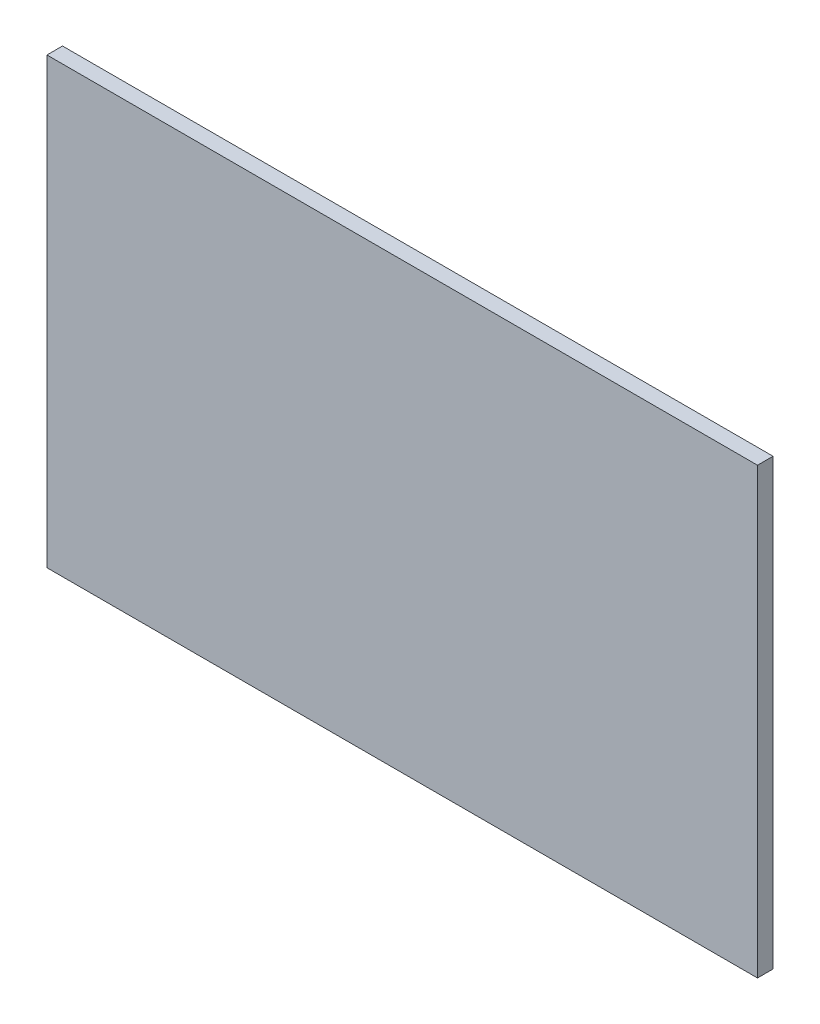
ISO-10303-21;
HEADER;
FILE_DESCRIPTION(('STEP AP214'),'2;1');
FILE_NAME('part.step','',(''),(''),'','','');
FILE_SCHEMA(('AUTOMOTIVE_DESIGN { 1 0 10303 214 1 1 1 1 }'));
ENDSEC;
DATA;
#1=APPLICATION_CONTEXT('core data for automotive mechanical design processes');
#2=APPLICATION_PROTOCOL_DEFINITION('international standard','automotive_design',2000,#1);
#3=PRODUCT_CONTEXT('',#1,'mechanical');
#4=PRODUCT('Part','Part','',(#3));
#5=PRODUCT_RELATED_PRODUCT_CATEGORY('part','',(#4));
#6=PRODUCT_DEFINITION_FORMATION('','',#4);
#7=PRODUCT_DEFINITION_CONTEXT('part definition',#1,'design');
#8=PRODUCT_DEFINITION('design','',#6,#7);
#9=PRODUCT_DEFINITION_SHAPE('','',#8);
#10=(LENGTH_UNIT() NAMED_UNIT(*) SI_UNIT(.MILLI.,.METRE.));
#11=(NAMED_UNIT(*) PLANE_ANGLE_UNIT() SI_UNIT($,.RADIAN.));
#12=(NAMED_UNIT(*) SI_UNIT($,.STERADIAN.) SOLID_ANGLE_UNIT());
#13=UNCERTAINTY_MEASURE_WITH_UNIT(LENGTH_MEASURE(1.E-05),#10,'distance_accuracy_value','');
#14=(GEOMETRIC_REPRESENTATION_CONTEXT(3) GLOBAL_UNCERTAINTY_ASSIGNED_CONTEXT((#13)) GLOBAL_UNIT_ASSIGNED_CONTEXT((#10,
#11,#12)) REPRESENTATION_CONTEXT('',''));
#15=CARTESIAN_POINT('',(0.,0.,0.));
#16=DIRECTION('',(0.,0.,1.));
#17=DIRECTION('',(1.,0.,0.));
#18=AXIS2_PLACEMENT_3D('',#15,#16,#17);
#19=CARTESIAN_POINT('',(98.15,-115.3,1.635));
#20=DIRECTION('',(0.,0.,-1.));
#21=DIRECTION('',(0.,-1.,0.));
#22=AXIS2_PLACEMENT_3D('',#19,#20,#21);
#23=PLANE('',#22);
#24=DIRECTION('',(0.,-1.,0.));
#25=VECTOR('',#24,1.);
#26=CARTESIAN_POINT('',(98.95,-114.8,1.635));
#27=LINE('',#26,#25);
#28=CARTESIAN_POINT('',(98.95,-114.8,1.635));
#29=VERTEX_POINT('',#28);
#30=CARTESIAN_POINT('',(98.95,-115.8,1.635));
#31=VERTEX_POINT('',#30);
#32=EDGE_CURVE('E20',#29,#31,#27,.T.);
#33=ORIENTED_EDGE('',*,*,#32,.F.);
#34=DIRECTION('',(1.,0.,0.));
#35=VECTOR('',#34,1.);
#36=CARTESIAN_POINT('',(97.35,-114.8,1.635));
#37=LINE('',#36,#35);
#38=CARTESIAN_POINT('',(97.35,-114.8,1.635));
#39=VERTEX_POINT('',#38);
#40=EDGE_CURVE('E62',#39,#29,#37,.T.);
#41=ORIENTED_EDGE('',*,*,#40,.F.);
#42=DIRECTION('',(0.,1.,0.));
#43=VECTOR('',#42,1.);
#44=CARTESIAN_POINT('',(97.35,-115.8,1.635));
#45=LINE('',#44,#43);
#46=CARTESIAN_POINT('',(97.35,-115.8,1.635));
#47=VERTEX_POINT('',#46);
#48=EDGE_CURVE('E90',#47,#39,#45,.T.);
#49=ORIENTED_EDGE('',*,*,#48,.F.);
#50=DIRECTION('',(-1.,0.,0.));
#51=VECTOR('',#50,1.);
#52=CARTESIAN_POINT('',(98.95,-115.8,1.635));
#53=LINE('',#52,#51);
#54=EDGE_CURVE('E100',#31,#47,#53,.T.);
#55=ORIENTED_EDGE('',*,*,#54,.F.);
#56=EDGE_LOOP('',(#33,#41,#49,#55));
#57=FACE_BOUND('',#56,.T.);
#58=ADVANCED_FACE('F17',(#57),#23,.F.);
#59=CARTESIAN_POINT('',(98.15,-115.3,1.6));
#60=DIRECTION('',(0.,0.,-1.));
#61=DIRECTION('',(0.,-1.,0.));
#62=AXIS2_PLACEMENT_3D('',#59,#60,#61);
#63=PLANE('',#62);
#64=DIRECTION('',(-1.,0.,0.));
#65=VECTOR('',#64,1.);
#66=CARTESIAN_POINT('',(98.95,-115.8,1.6));
#67=LINE('',#66,#65);
#68=CARTESIAN_POINT('',(98.95,-115.8,1.6));
#69=VERTEX_POINT('',#68);
#70=CARTESIAN_POINT('',(97.35,-115.8,1.6));
#71=VERTEX_POINT('',#70);
#72=EDGE_CURVE('E83',#69,#71,#67,.T.);
#73=ORIENTED_EDGE('',*,*,#72,.T.);
#74=DIRECTION('',(0.,1.,0.));
#75=VECTOR('',#74,1.);
#76=CARTESIAN_POINT('',(97.35,-115.8,1.6));
#77=LINE('',#76,#75);
#78=CARTESIAN_POINT('',(97.35,-114.8,1.6));
#79=VERTEX_POINT('',#78);
#80=EDGE_CURVE('E80',#71,#79,#77,.T.);
#81=ORIENTED_EDGE('',*,*,#80,.T.);
#82=DIRECTION('',(1.,0.,0.));
#83=VECTOR('',#82,1.);
#84=CARTESIAN_POINT('',(97.35,-114.8,1.6));
#85=LINE('',#84,#83);
#86=CARTESIAN_POINT('',(98.95,-114.8,1.6));
#87=VERTEX_POINT('',#86);
#88=EDGE_CURVE('E70',#79,#87,#85,.T.);
#89=ORIENTED_EDGE('',*,*,#88,.T.);
#90=DIRECTION('',(0.,-1.,0.));
#91=VECTOR('',#90,1.);
#92=CARTESIAN_POINT('',(98.95,-114.8,1.6));
#93=LINE('',#92,#91);
#94=EDGE_CURVE('E11',#87,#69,#93,.T.);
#95=ORIENTED_EDGE('',*,*,#94,.T.);
#96=EDGE_LOOP('',(#73,#81,#89,#95));
#97=FACE_BOUND('',#96,.T.);
#98=ADVANCED_FACE('F81',(#97),#63,.T.);
#99=CARTESIAN_POINT('',(98.95,-114.8,1.6));
#100=DIRECTION('',(1.,0.,0.));
#101=DIRECTION('',(0.,1.,0.));
#102=AXIS2_PLACEMENT_3D('',#99,#100,#101);
#103=PLANE('',#102);
#104=DIRECTION('',(0.,0.,1.));
#105=VECTOR('',#104,1.);
#106=CARTESIAN_POINT('',(98.95,-114.8,1.6));
#107=LINE('',#106,#105);
#108=EDGE_CURVE('E76',#87,#29,#107,.T.);
#109=ORIENTED_EDGE('',*,*,#108,.T.);
#110=ORIENTED_EDGE('',*,*,#32,.T.);
#111=DIRECTION('',(0.,0.,1.));
#112=VECTOR('',#111,1.);
#113=CARTESIAN_POINT('',(98.95,-115.8,1.6));
#114=LINE('',#113,#112);
#115=EDGE_CURVE('E137',#69,#31,#114,.T.);
#116=ORIENTED_EDGE('',*,*,#115,.F.);
#117=ORIENTED_EDGE('',*,*,#94,.F.);
#118=EDGE_LOOP('',(#109,#110,#116,#117));
#119=FACE_BOUND('',#118,.T.);
#120=ADVANCED_FACE('F146',(#119),#103,.T.);
#121=CARTESIAN_POINT('',(97.35,-114.8,1.6));
#122=DIRECTION('',(0.,1.,0.));
#123=DIRECTION('',(1.,0.,0.));
#124=AXIS2_PLACEMENT_3D('',#121,#122,#123);
#125=PLANE('',#124);
#126=DIRECTION('',(0.,0.,1.));
#127=VECTOR('',#126,1.);
#128=CARTESIAN_POINT('',(97.35,-114.8,1.6));
#129=LINE('',#128,#127);
#130=EDGE_CURVE('E74',#79,#39,#129,.T.);
#131=ORIENTED_EDGE('',*,*,#130,.T.);
#132=ORIENTED_EDGE('',*,*,#40,.T.);
#133=ORIENTED_EDGE('',*,*,#108,.F.);
#134=ORIENTED_EDGE('',*,*,#88,.F.);
#135=EDGE_LOOP('',(#131,#132,#133,#134));
#136=FACE_BOUND('',#135,.T.);
#137=ADVANCED_FACE('F72',(#136),#125,.T.);
#138=CARTESIAN_POINT('',(97.35,-115.8,1.6));
#139=DIRECTION('',(-1.,0.,0.));
#140=DIRECTION('',(0.,0.,1.));
#141=AXIS2_PLACEMENT_3D('',#138,#139,#140);
#142=PLANE('',#141);
#143=DIRECTION('',(0.,0.,1.));
#144=VECTOR('',#143,1.);
#145=CARTESIAN_POINT('',(97.35,-115.8,1.6));
#146=LINE('',#145,#144);
#147=EDGE_CURVE('E102',#71,#47,#146,.T.);
#148=ORIENTED_EDGE('',*,*,#147,.T.);
#149=ORIENTED_EDGE('',*,*,#48,.T.);
#150=ORIENTED_EDGE('',*,*,#130,.F.);
#151=ORIENTED_EDGE('',*,*,#80,.F.);
#152=EDGE_LOOP('',(#148,#149,#150,#151));
#153=FACE_BOUND('',#152,.T.);
#154=ADVANCED_FACE('F89',(#153),#142,.T.);
#155=CARTESIAN_POINT('',(98.95,-115.8,1.6));
#156=DIRECTION('',(0.,-1.,0.));
#157=DIRECTION('',(0.,0.,-1.));
#158=AXIS2_PLACEMENT_3D('',#155,#156,#157);
#159=PLANE('',#158);
#160=ORIENTED_EDGE('',*,*,#115,.T.);
#161=ORIENTED_EDGE('',*,*,#54,.T.);
#162=ORIENTED_EDGE('',*,*,#147,.F.);
#163=ORIENTED_EDGE('',*,*,#72,.F.);
#164=EDGE_LOOP('',(#160,#161,#162,#163));
#165=FACE_BOUND('',#164,.T.);
#166=ADVANCED_FACE('F144',(#165),#159,.T.);
#167=CLOSED_SHELL('',(#58,#98,#120,#137,#154,#166));
#168=MANIFOLD_SOLID_BREP('B1',#167);
#169=ADVANCED_BREP_SHAPE_REPRESENTATION('',(#18,#168),#14);
#170=SHAPE_DEFINITION_REPRESENTATION(#9,#169);
ENDSEC;
END-ISO-10303-21;
